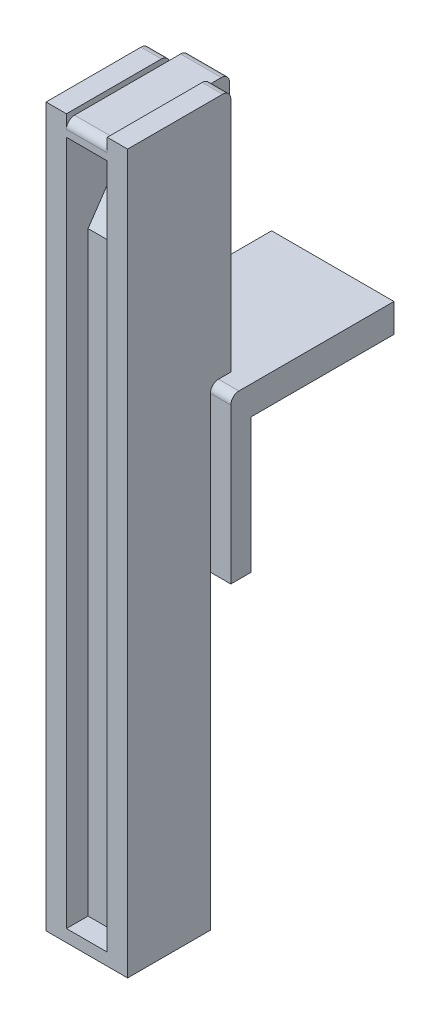
ISO-10303-21;
HEADER;
FILE_DESCRIPTION(('STEP AP214'),'2;1');
FILE_NAME('part.step','',(''),(''),'','','');
FILE_SCHEMA(('AUTOMOTIVE_DESIGN { 1 0 10303 214 1 1 1 1 }'));
ENDSEC;
DATA;
#1=APPLICATION_CONTEXT('core data for automotive mechanical design processes');
#2=APPLICATION_PROTOCOL_DEFINITION('international standard','automotive_design',2000,#1);
#3=PRODUCT_CONTEXT('',#1,'mechanical');
#4=PRODUCT('Part','Part','',(#3));
#5=PRODUCT_RELATED_PRODUCT_CATEGORY('part','',(#4));
#6=PRODUCT_DEFINITION_FORMATION('','',#4);
#7=PRODUCT_DEFINITION_CONTEXT('part definition',#1,'design');
#8=PRODUCT_DEFINITION('design','',#6,#7);
#9=PRODUCT_DEFINITION_SHAPE('','',#8);
#10=(LENGTH_UNIT() NAMED_UNIT(*) SI_UNIT(.MILLI.,.METRE.));
#11=(NAMED_UNIT(*) PLANE_ANGLE_UNIT() SI_UNIT($,.RADIAN.));
#12=(NAMED_UNIT(*) SI_UNIT($,.STERADIAN.) SOLID_ANGLE_UNIT());
#13=UNCERTAINTY_MEASURE_WITH_UNIT(LENGTH_MEASURE(1.E-05),#10,'distance_accuracy_value','');
#14=(GEOMETRIC_REPRESENTATION_CONTEXT(3) GLOBAL_UNCERTAINTY_ASSIGNED_CONTEXT((#13)) GLOBAL_UNIT_ASSIGNED_CONTEXT((#10,
#11,#12)) REPRESENTATION_CONTEXT('',''));
#15=CARTESIAN_POINT('',(0.,0.,0.));
#16=DIRECTION('',(0.,0.,1.));
#17=DIRECTION('',(1.,0.,0.));
#18=AXIS2_PLACEMENT_3D('',#15,#16,#17);
#19=CARTESIAN_POINT('',(-5.,0.,0.));
#20=DIRECTION('',(1.,0.,0.));
#21=DIRECTION('',(0.,0.,-1.));
#22=AXIS2_PLACEMENT_3D('',#19,#20,#21);
#23=PLANE('',#22);
#24=DIRECTION('',(0.,-1.,0.));
#25=VECTOR('',#24,1.);
#26=CARTESIAN_POINT('',(-5.,60.,20.3));
#27=LINE('',#26,#25);
#28=CARTESIAN_POINT('',(-5.,55.,20.3));
#29=VERTEX_POINT('',#28);
#30=CARTESIAN_POINT('',(-5.,-113.,20.3));
#31=VERTEX_POINT('',#30);
#32=EDGE_CURVE('E288',#29,#31,#27,.T.);
#33=ORIENTED_EDGE('',*,*,#32,.T.);
#34=DIRECTION('',(0.,0.,-1.));
#35=VECTOR('',#34,1.);
#36=CARTESIAN_POINT('',(-5.,-113.,20.3));
#37=LINE('',#36,#35);
#38=CARTESIAN_POINT('',(-5.,-113.,15.));
#39=VERTEX_POINT('',#38);
#40=EDGE_CURVE('E251',#31,#39,#37,.T.);
#41=ORIENTED_EDGE('',*,*,#40,.T.);
#42=DIRECTION('',(0.,-1.,0.));
#43=VECTOR('',#42,1.);
#44=CARTESIAN_POINT('',(-5.,-116.,15.));
#45=LINE('',#44,#43);
#46=CARTESIAN_POINT('',(-5.,32.9715744201414,15.));
#47=VERTEX_POINT('',#46);
#48=EDGE_CURVE('E327',#47,#39,#45,.T.);
#49=ORIENTED_EDGE('',*,*,#48,.F.);
#50=DIRECTION('',(0.,-0.826584392153763,0.56281279538386));
#51=VECTOR('',#50,1.);
#52=CARTESIAN_POINT('',(-5.,55.0015744201414,0.));
#53=LINE('',#52,#51);
#54=CARTESIAN_POINT('',(-5.,55.,0.00107200645125644));
#55=VERTEX_POINT('',#54);
#56=EDGE_CURVE('E320',#55,#47,#53,.T.);
#57=ORIENTED_EDGE('',*,*,#56,.F.);
#58=DIRECTION('',(0.,0.,1.));
#59=VECTOR('',#58,1.);
#60=CARTESIAN_POINT('',(-5.,55.,0.));
#61=LINE('',#60,#59);
#62=EDGE_CURVE('E521',#55,#29,#61,.T.);
#63=ORIENTED_EDGE('',*,*,#62,.T.);
#64=EDGE_LOOP('',(#33,#41,#49,#57,#63));
#65=FACE_BOUND('',#64,.T.);
#66=ADVANCED_FACE('F43',(#65),#23,.T.);
#67=CARTESIAN_POINT('',(5.,0.,0.));
#68=DIRECTION('',(-1.,0.,0.));
#69=DIRECTION('',(0.,0.,-1.));
#70=AXIS2_PLACEMENT_3D('',#67,#68,#69);
#71=PLANE('',#70);
#72=DIRECTION('',(0.,-1.,0.));
#73=VECTOR('',#72,1.);
#74=CARTESIAN_POINT('',(5.,-116.,15.));
#75=LINE('',#74,#73);
#76=CARTESIAN_POINT('',(5.,32.9715744201414,15.));
#77=VERTEX_POINT('',#76);
#78=CARTESIAN_POINT('',(5.,-113.,15.));
#79=VERTEX_POINT('',#78);
#80=EDGE_CURVE('E265',#77,#79,#75,.T.);
#81=ORIENTED_EDGE('',*,*,#80,.T.);
#82=DIRECTION('',(0.,0.,-1.));
#83=VECTOR('',#82,1.);
#84=CARTESIAN_POINT('',(5.,-113.,20.3));
#85=LINE('',#84,#83);
#86=CARTESIAN_POINT('',(5.,-113.,20.3));
#87=VERTEX_POINT('',#86);
#88=EDGE_CURVE('E248',#87,#79,#85,.T.);
#89=ORIENTED_EDGE('',*,*,#88,.F.);
#90=DIRECTION('',(0.,-1.,0.));
#91=VECTOR('',#90,1.);
#92=CARTESIAN_POINT('',(5.,60.,20.3));
#93=LINE('',#92,#91);
#94=CARTESIAN_POINT('',(5.,55.,20.3));
#95=VERTEX_POINT('',#94);
#96=EDGE_CURVE('E263',#95,#87,#93,.T.);
#97=ORIENTED_EDGE('',*,*,#96,.F.);
#98=DIRECTION('',(0.,0.,1.));
#99=VECTOR('',#98,1.);
#100=CARTESIAN_POINT('',(5.,55.,0.));
#101=LINE('',#100,#99);
#102=CARTESIAN_POINT('',(5.,55.,0.00107200645125644));
#103=VERTEX_POINT('',#102);
#104=EDGE_CURVE('E512',#103,#95,#101,.T.);
#105=ORIENTED_EDGE('',*,*,#104,.F.);
#106=DIRECTION('',(0.,-0.826584392153763,0.56281279538386));
#107=VECTOR('',#106,1.);
#108=CARTESIAN_POINT('',(5.,55.0015744201414,0.));
#109=LINE('',#108,#107);
#110=EDGE_CURVE('E325',#103,#77,#109,.T.);
#111=ORIENTED_EDGE('',*,*,#110,.T.);
#112=EDGE_LOOP('',(#81,#89,#97,#105,#111));
#113=FACE_BOUND('',#112,.T.);
#114=ADVANCED_FACE('F261',(#113),#71,.T.);
#115=CARTESIAN_POINT('',(5.,-116.,15.));
#116=DIRECTION('',(0.,0.,-1.));
#117=DIRECTION('',(-1.,0.,0.));
#118=AXIS2_PLACEMENT_3D('',#115,#116,#117);
#119=PLANE('',#118);
#120=DIRECTION('',(-1.,0.,0.));
#121=VECTOR('',#120,1.);
#122=CARTESIAN_POINT('',(-5.,-113.,15.));
#123=LINE('',#122,#121);
#124=EDGE_CURVE('E256',#79,#39,#123,.T.);
#125=ORIENTED_EDGE('',*,*,#124,.F.);
#126=ORIENTED_EDGE('',*,*,#80,.F.);
#127=DIRECTION('',(-1.,0.,0.));
#128=VECTOR('',#127,1.);
#129=CARTESIAN_POINT('',(5.,32.9715744201414,15.));
#130=LINE('',#129,#128);
#131=EDGE_CURVE('E334',#77,#47,#130,.T.);
#132=ORIENTED_EDGE('',*,*,#131,.T.);
#133=ORIENTED_EDGE('',*,*,#48,.T.);
#134=EDGE_LOOP('',(#125,#126,#132,#133));
#135=FACE_BOUND('',#134,.T.);
#136=ADVANCED_FACE('F530',(#135),#119,.F.);
#137=CARTESIAN_POINT('',(5.,55.0015744201414,0.));
#138=DIRECTION('',(0.,-0.56281279538386,-0.826584392153763));
#139=DIRECTION('',(0.,0.826584392153763,-0.56281279538386));
#140=AXIS2_PLACEMENT_3D('',#137,#138,#139);
#141=PLANE('',#140);
#142=DIRECTION('',(1.,0.,0.));
#143=VECTOR('',#142,1.);
#144=CARTESIAN_POINT('',(5.,55.,0.00107200645125644));
#145=LINE('',#144,#143);
#146=EDGE_CURVE('E272',#55,#103,#145,.T.);
#147=ORIENTED_EDGE('',*,*,#146,.F.);
#148=ORIENTED_EDGE('',*,*,#56,.T.);
#149=ORIENTED_EDGE('',*,*,#131,.F.);
#150=ORIENTED_EDGE('',*,*,#110,.F.);
#151=EDGE_LOOP('',(#147,#148,#149,#150));
#152=FACE_BOUND('',#151,.T.);
#153=ADVANCED_FACE('F535',(#152),#141,.F.);
#154=DIRECTION('',(0.,0.,-1.));
#155=VECTOR('',#154,1.);
#156=CARTESIAN_POINT('',(-5.,58.7,20.3));
#157=LINE('',#156,#155);
#158=CARTESIAN_POINT('',(-5.,58.7,18.3));
#159=VERTEX_POINT('',#158);
#160=CARTESIAN_POINT('',(-5.,58.7,-4.87349939951952));
#161=VERTEX_POINT('',#160);
#162=EDGE_CURVE('E517',#159,#161,#157,.T.);
#163=ORIENTED_EDGE('',*,*,#162,.T.);
#164=CARTESIAN_POINT('',(-5.,58.,-3.));
#165=DIRECTION('',(1.,0.,0.));
#166=DIRECTION('',(0.,0.,-1.));
#167=AXIS2_PLACEMENT_3D('',#164,#165,#166);
#168=CIRCLE('',#167,2.);
#169=CARTESIAN_POINT('',(-5.,60.,-3.));
#170=VERTEX_POINT('',#169);
#171=EDGE_CURVE('E407',#161,#170,#168,.T.);
#172=ORIENTED_EDGE('',*,*,#171,.T.);
#173=DIRECTION('',(0.,0.,1.));
#174=VECTOR('',#173,1.);
#175=CARTESIAN_POINT('',(-5.,60.,0.));
#176=LINE('',#175,#174);
#177=CARTESIAN_POINT('',(-5.,60.,20.3));
#178=VERTEX_POINT('',#177);
#179=EDGE_CURVE('E296',#170,#178,#176,.T.);
#180=ORIENTED_EDGE('',*,*,#179,.T.);
#181=CARTESIAN_POINT('',(-5.,56.7,20.3));
#182=VERTEX_POINT('',#181);
#183=EDGE_CURVE('E311',#178,#182,#27,.T.);
#184=ORIENTED_EDGE('',*,*,#183,.T.);
#185=CARTESIAN_POINT('',(-5.,56.7,18.3));
#186=DIRECTION('',(1.,0.,0.));
#187=DIRECTION('',(0.,0.,-1.));
#188=AXIS2_PLACEMENT_3D('',#185,#186,#187);
#189=CIRCLE('',#188,2.);
#190=EDGE_CURVE('E416',#182,#159,#189,.F.);
#191=ORIENTED_EDGE('',*,*,#190,.T.);
#192=EDGE_LOOP('',(#163,#172,#180,#184,#191));
#193=FACE_BOUND('',#192,.T.);
#194=ADVANCED_FACE('F556',(#193),#23,.T.);
#195=DIRECTION('',(0.,0.,1.));
#196=VECTOR('',#195,1.);
#197=CARTESIAN_POINT('',(5.,60.,-5.));
#198=LINE('',#197,#196);
#199=CARTESIAN_POINT('',(5.,60.,-3.));
#200=VERTEX_POINT('',#199);
#201=CARTESIAN_POINT('',(5.,60.,20.3));
#202=VERTEX_POINT('',#201);
#203=EDGE_CURVE('E274',#200,#202,#198,.T.);
#204=ORIENTED_EDGE('',*,*,#203,.F.);
#205=CARTESIAN_POINT('',(5.,58.,-3.));
#206=DIRECTION('',(-1.,0.,0.));
#207=DIRECTION('',(0.,0.,1.));
#208=AXIS2_PLACEMENT_3D('',#205,#206,#207);
#209=CIRCLE('',#208,2.);
#210=CARTESIAN_POINT('',(5.,58.7,-4.87349939951952));
#211=VERTEX_POINT('',#210);
#212=EDGE_CURVE('E397',#200,#211,#209,.T.);
#213=ORIENTED_EDGE('',*,*,#212,.T.);
#214=DIRECTION('',(0.,0.,-1.));
#215=VECTOR('',#214,1.);
#216=CARTESIAN_POINT('',(5.,58.7,20.3));
#217=LINE('',#216,#215);
#218=CARTESIAN_POINT('',(5.,58.7,18.3));
#219=VERTEX_POINT('',#218);
#220=EDGE_CURVE('E508',#219,#211,#217,.T.);
#221=ORIENTED_EDGE('',*,*,#220,.F.);
#222=CARTESIAN_POINT('',(5.,56.7,18.3));
#223=DIRECTION('',(-1.,0.,0.));
#224=DIRECTION('',(0.,0.,1.));
#225=AXIS2_PLACEMENT_3D('',#222,#223,#224);
#226=CIRCLE('',#225,2.);
#227=CARTESIAN_POINT('',(5.,56.7,20.3));
#228=VERTEX_POINT('',#227);
#229=EDGE_CURVE('E413',#219,#228,#226,.F.);
#230=ORIENTED_EDGE('',*,*,#229,.T.);
#231=EDGE_CURVE('E271',#202,#228,#93,.T.);
#232=ORIENTED_EDGE('',*,*,#231,.F.);
#233=EDGE_LOOP('',(#204,#213,#221,#230,#232));
#234=FACE_BOUND('',#233,.T.);
#235=ADVANCED_FACE('F562',(#234),#71,.T.);
#236=CARTESIAN_POINT('',(15.,0.,-40.));
#237=DIRECTION('',(0.,-1.,0.));
#238=DIRECTION('',(0.,0.,-1.));
#239=AXIS2_PLACEMENT_3D('',#236,#237,#238);
#240=PLANE('',#239);
#241=DIRECTION('',(0.,0.,1.));
#242=VECTOR('',#241,1.);
#243=CARTESIAN_POINT('',(-15.,0.,-40.));
#244=LINE('',#243,#242);
#245=CARTESIAN_POINT('',(-15.,0.,-40.));
#246=VERTEX_POINT('',#245);
#247=CARTESIAN_POINT('',(-15.,0.,-2.));
#248=VERTEX_POINT('',#247);
#249=EDGE_CURVE('E337',#246,#248,#244,.T.);
#250=ORIENTED_EDGE('',*,*,#249,.T.);
#251=DIRECTION('',(-1.,0.,0.));
#252=VECTOR('',#251,1.);
#253=CARTESIAN_POINT('',(15.,0.,-2.));
#254=LINE('',#253,#252);
#255=CARTESIAN_POINT('',(-10.,0.,-2.));
#256=VERTEX_POINT('',#255);
#257=EDGE_CURVE('E430',#248,#256,#254,.F.);
#258=ORIENTED_EDGE('',*,*,#257,.T.);
#259=DIRECTION('',(0.,0.,-1.));
#260=VECTOR('',#259,1.);
#261=CARTESIAN_POINT('',(-10.,0.,0.));
#262=LINE('',#261,#260);
#263=CARTESIAN_POINT('',(-10.,0.,-5.));
#264=VERTEX_POINT('',#263);
#265=EDGE_CURVE('E303',#256,#264,#262,.T.);
#266=ORIENTED_EDGE('',*,*,#265,.T.);
#267=DIRECTION('',(1.,0.,0.));
#268=VECTOR('',#267,1.);
#269=CARTESIAN_POINT('',(-10.,0.,-5.));
#270=LINE('',#269,#268);
#271=CARTESIAN_POINT('',(-5.,0.,-5.));
#272=VERTEX_POINT('',#271);
#273=EDGE_CURVE('E321',#264,#272,#270,.T.);
#274=ORIENTED_EDGE('',*,*,#273,.T.);
#275=DIRECTION('',(0.,0.,1.));
#276=VECTOR('',#275,1.);
#277=CARTESIAN_POINT('',(-5.,0.,-9.69999999999999));
#278=LINE('',#277,#276);
#279=CARTESIAN_POINT('',(-5.,0.,-9.69999999999999));
#280=VERTEX_POINT('',#279);
#281=EDGE_CURVE('E507',#280,#272,#278,.T.);
#282=ORIENTED_EDGE('',*,*,#281,.F.);
#283=DIRECTION('',(1.,0.,0.));
#284=VECTOR('',#283,1.);
#285=CARTESIAN_POINT('',(-5.,0.,-9.69999999999999));
#286=LINE('',#285,#284);
#287=CARTESIAN_POINT('',(5.,0.,-9.69999999999999));
#288=VERTEX_POINT('',#287);
#289=EDGE_CURVE('E501',#280,#288,#286,.T.);
#290=ORIENTED_EDGE('',*,*,#289,.T.);
#291=DIRECTION('',(0.,0.,1.));
#292=VECTOR('',#291,1.);
#293=CARTESIAN_POINT('',(5.,0.,-9.69999999999999));
#294=LINE('',#293,#292);
#295=CARTESIAN_POINT('',(5.,0.,-5.));
#296=VERTEX_POINT('',#295);
#297=EDGE_CURVE('E266',#288,#296,#294,.T.);
#298=ORIENTED_EDGE('',*,*,#297,.T.);
#299=DIRECTION('',(-1.,0.,0.));
#300=VECTOR('',#299,1.);
#301=CARTESIAN_POINT('',(10.,0.,-5.));
#302=LINE('',#301,#300);
#303=CARTESIAN_POINT('',(10.,0.,-5.));
#304=VERTEX_POINT('',#303);
#305=EDGE_CURVE('E285',#304,#296,#302,.T.);
#306=ORIENTED_EDGE('',*,*,#305,.F.);
#307=DIRECTION('',(0.,0.,-1.));
#308=VECTOR('',#307,1.);
#309=CARTESIAN_POINT('',(10.,0.,0.));
#310=LINE('',#309,#308);
#311=CARTESIAN_POINT('',(10.,0.,-2.));
#312=VERTEX_POINT('',#311);
#313=EDGE_CURVE('E490',#312,#304,#310,.T.);
#314=ORIENTED_EDGE('',*,*,#313,.F.);
#315=DIRECTION('',(-1.,0.,0.));
#316=VECTOR('',#315,1.);
#317=CARTESIAN_POINT('',(15.,0.,-2.));
#318=LINE('',#317,#316);
#319=CARTESIAN_POINT('',(15.,0.,-2.));
#320=VERTEX_POINT('',#319);
#321=EDGE_CURVE('E428',#312,#320,#318,.F.);
#322=ORIENTED_EDGE('',*,*,#321,.T.);
#323=DIRECTION('',(0.,0.,1.));
#324=VECTOR('',#323,1.);
#325=CARTESIAN_POINT('',(15.,0.,-40.));
#326=LINE('',#325,#324);
#327=CARTESIAN_POINT('',(15.,0.,-40.));
#328=VERTEX_POINT('',#327);
#329=EDGE_CURVE('E338',#328,#320,#326,.T.);
#330=ORIENTED_EDGE('',*,*,#329,.F.);
#331=DIRECTION('',(-1.,0.,0.));
#332=VECTOR('',#331,1.);
#333=CARTESIAN_POINT('',(15.,0.,-40.));
#334=LINE('',#333,#332);
#335=EDGE_CURVE('E351',#328,#246,#334,.T.);
#336=ORIENTED_EDGE('',*,*,#335,.T.);
#337=EDGE_LOOP('',(#250,#258,#266,#274,#282,#290,#298,#306,#314,#322,#330,#336));
#338=FACE_BOUND('',#337,.T.);
#339=ADVANCED_FACE('F458',(#338),#240,.F.);
#340=CARTESIAN_POINT('',(15.,0.,0.));
#341=DIRECTION('',(0.,0.,-1.));
#342=DIRECTION('',(-1.,0.,0.));
#343=AXIS2_PLACEMENT_3D('',#340,#341,#342);
#344=PLANE('',#343);
#345=DIRECTION('',(0.,-1.,0.));
#346=VECTOR('',#345,1.);
#347=CARTESIAN_POINT('',(15.,0.,0.));
#348=LINE('',#347,#346);
#349=CARTESIAN_POINT('',(15.,-2.,0.));
#350=VERTEX_POINT('',#349);
#351=CARTESIAN_POINT('',(15.,-40.,0.));
#352=VERTEX_POINT('',#351);
#353=EDGE_CURVE('E340',#350,#352,#348,.T.);
#354=ORIENTED_EDGE('',*,*,#353,.F.);
#355=DIRECTION('',(-1.,0.,0.));
#356=VECTOR('',#355,1.);
#357=CARTESIAN_POINT('',(15.,-2.,0.));
#358=LINE('',#357,#356);
#359=CARTESIAN_POINT('',(10.,-2.00000000000003,0.));
#360=VERTEX_POINT('',#359);
#361=EDGE_CURVE('E432',#350,#360,#358,.T.);
#362=ORIENTED_EDGE('',*,*,#361,.T.);
#363=DIRECTION('',(0.,1.,0.));
#364=VECTOR('',#363,1.);
#365=CARTESIAN_POINT('',(10.,-116.,0.));
#366=LINE('',#365,#364);
#367=CARTESIAN_POINT('',(10.,-40.,0.));
#368=VERTEX_POINT('',#367);
#369=EDGE_CURVE('E487',#368,#360,#366,.T.);
#370=ORIENTED_EDGE('',*,*,#369,.F.);
#371=DIRECTION('',(-1.,0.,0.));
#372=VECTOR('',#371,1.);
#373=CARTESIAN_POINT('',(15.,-40.,0.));
#374=LINE('',#373,#372);
#375=EDGE_CURVE('E375',#352,#368,#374,.T.);
#376=ORIENTED_EDGE('',*,*,#375,.F.);
#377=EDGE_LOOP('',(#354,#362,#370,#376));
#378=FACE_BOUND('',#377,.T.);
#379=ADVANCED_FACE('F488',(#378),#344,.F.);
#380=DIRECTION('',(0.,1.,0.));
#381=VECTOR('',#380,1.);
#382=CARTESIAN_POINT('',(-10.,-116.,0.));
#383=LINE('',#382,#381);
#384=CARTESIAN_POINT('',(-10.,-40.,0.));
#385=VERTEX_POINT('',#384);
#386=CARTESIAN_POINT('',(-10.,-2.00000000000003,0.));
#387=VERTEX_POINT('',#386);
#388=EDGE_CURVE('E299',#385,#387,#383,.T.);
#389=ORIENTED_EDGE('',*,*,#388,.T.);
#390=DIRECTION('',(-1.,0.,0.));
#391=VECTOR('',#390,1.);
#392=CARTESIAN_POINT('',(15.,-2.,0.));
#393=LINE('',#392,#391);
#394=CARTESIAN_POINT('',(-15.,-2.,0.));
#395=VERTEX_POINT('',#394);
#396=EDGE_CURVE('E423',#387,#395,#393,.T.);
#397=ORIENTED_EDGE('',*,*,#396,.T.);
#398=DIRECTION('',(0.,-1.,0.));
#399=VECTOR('',#398,1.);
#400=CARTESIAN_POINT('',(-15.,0.,0.));
#401=LINE('',#400,#399);
#402=CARTESIAN_POINT('',(-15.,-40.,0.));
#403=VERTEX_POINT('',#402);
#404=EDGE_CURVE('E354',#395,#403,#401,.T.);
#405=ORIENTED_EDGE('',*,*,#404,.T.);
#406=EDGE_CURVE('E374',#385,#403,#374,.T.);
#407=ORIENTED_EDGE('',*,*,#406,.F.);
#408=EDGE_LOOP('',(#389,#397,#405,#407));
#409=FACE_BOUND('',#408,.T.);
#410=ADVANCED_FACE('F448',(#409),#344,.F.);
#411=CARTESIAN_POINT('',(15.,-40.,0.));
#412=DIRECTION('',(0.,1.,0.));
#413=DIRECTION('',(0.,0.,1.));
#414=AXIS2_PLACEMENT_3D('',#411,#412,#413);
#415=PLANE('',#414);
#416=DIRECTION('',(0.,0.,-1.));
#417=VECTOR('',#416,1.);
#418=CARTESIAN_POINT('',(-15.,-40.,0.));
#419=LINE('',#418,#417);
#420=CARTESIAN_POINT('',(-15.,-40.,-5.00000000000001));
#421=VERTEX_POINT('',#420);
#422=EDGE_CURVE('E356',#403,#421,#419,.T.);
#423=ORIENTED_EDGE('',*,*,#422,.T.);
#424=DIRECTION('',(-1.,0.,0.));
#425=VECTOR('',#424,1.);
#426=CARTESIAN_POINT('',(15.,-40.,-5.00000000000001));
#427=LINE('',#426,#425);
#428=CARTESIAN_POINT('',(15.,-40.,-5.00000000000001));
#429=VERTEX_POINT('',#428);
#430=EDGE_CURVE('E371',#429,#421,#427,.T.);
#431=ORIENTED_EDGE('',*,*,#430,.F.);
#432=DIRECTION('',(0.,0.,-1.));
#433=VECTOR('',#432,1.);
#434=CARTESIAN_POINT('',(15.,-40.,0.));
#435=LINE('',#434,#433);
#436=EDGE_CURVE('E343',#352,#429,#435,.T.);
#437=ORIENTED_EDGE('',*,*,#436,.F.);
#438=ORIENTED_EDGE('',*,*,#375,.T.);
#439=EDGE_CURVE('E379',#368,#385,#374,.T.);
#440=ORIENTED_EDGE('',*,*,#439,.T.);
#441=ORIENTED_EDGE('',*,*,#406,.T.);
#442=EDGE_LOOP('',(#423,#431,#437,#438,#440,#441));
#443=FACE_BOUND('',#442,.T.);
#444=ADVANCED_FACE('F477',(#443),#415,.F.);
#445=CARTESIAN_POINT('',(15.,-40.,-5.00000000000001));
#446=DIRECTION('',(0.,0.,1.));
#447=DIRECTION('',(1.,0.,0.));
#448=AXIS2_PLACEMENT_3D('',#445,#446,#447);
#449=PLANE('',#448);
#450=DIRECTION('',(0.,1.,0.));
#451=VECTOR('',#450,1.);
#452=CARTESIAN_POINT('',(-15.,-40.,-5.00000000000001));
#453=LINE('',#452,#451);
#454=CARTESIAN_POINT('',(-15.,-7.00000000000001,-5.00000000000001));
#455=VERTEX_POINT('',#454);
#456=EDGE_CURVE('E358',#421,#455,#453,.T.);
#457=ORIENTED_EDGE('',*,*,#456,.T.);
#458=DIRECTION('',(-1.,0.,0.));
#459=VECTOR('',#458,1.);
#460=CARTESIAN_POINT('',(15.,-7.00000000000001,-5.00000000000001));
#461=LINE('',#460,#459);
#462=CARTESIAN_POINT('',(15.,-7.00000000000001,-5.00000000000001));
#463=VERTEX_POINT('',#462);
#464=EDGE_CURVE('E368',#463,#455,#461,.T.);
#465=ORIENTED_EDGE('',*,*,#464,.F.);
#466=DIRECTION('',(0.,1.,0.));
#467=VECTOR('',#466,1.);
#468=CARTESIAN_POINT('',(15.,-40.,-5.00000000000001));
#469=LINE('',#468,#467);
#470=EDGE_CURVE('E345',#429,#463,#469,.T.);
#471=ORIENTED_EDGE('',*,*,#470,.F.);
#472=ORIENTED_EDGE('',*,*,#430,.T.);
#473=EDGE_LOOP('',(#457,#465,#471,#472));
#474=FACE_BOUND('',#473,.T.);
#475=ADVANCED_FACE('F473',(#474),#449,.F.);
#476=CARTESIAN_POINT('',(15.,-7.00000000000001,-5.00000000000001));
#477=DIRECTION('',(0.,1.,0.));
#478=DIRECTION('',(0.,0.,1.));
#479=AXIS2_PLACEMENT_3D('',#476,#477,#478);
#480=PLANE('',#479);
#481=DIRECTION('',(0.,0.,-1.));
#482=VECTOR('',#481,1.);
#483=CARTESIAN_POINT('',(-15.,-7.00000000000001,-5.00000000000001));
#484=LINE('',#483,#482);
#485=CARTESIAN_POINT('',(-15.,-7.00000000000001,-40.));
#486=VERTEX_POINT('',#485);
#487=EDGE_CURVE('E360',#455,#486,#484,.T.);
#488=ORIENTED_EDGE('',*,*,#487,.T.);
#489=DIRECTION('',(-1.,0.,0.));
#490=VECTOR('',#489,1.);
#491=CARTESIAN_POINT('',(15.,-7.00000000000001,-40.));
#492=LINE('',#491,#490);
#493=CARTESIAN_POINT('',(15.,-7.00000000000001,-40.));
#494=VERTEX_POINT('',#493);
#495=EDGE_CURVE('E365',#494,#486,#492,.T.);
#496=ORIENTED_EDGE('',*,*,#495,.F.);
#497=DIRECTION('',(0.,0.,-1.));
#498=VECTOR('',#497,1.);
#499=CARTESIAN_POINT('',(15.,-7.00000000000001,-5.00000000000001));
#500=LINE('',#499,#498);
#501=EDGE_CURVE('E347',#463,#494,#500,.T.);
#502=ORIENTED_EDGE('',*,*,#501,.F.);
#503=ORIENTED_EDGE('',*,*,#464,.T.);
#504=EDGE_LOOP('',(#488,#496,#502,#503));
#505=FACE_BOUND('',#504,.T.);
#506=ADVANCED_FACE('F468',(#505),#480,.F.);
#507=CARTESIAN_POINT('',(15.,-7.00000000000001,-40.));
#508=DIRECTION('',(0.,0.,1.));
#509=DIRECTION('',(1.,0.,0.));
#510=AXIS2_PLACEMENT_3D('',#507,#508,#509);
#511=PLANE('',#510);
#512=DIRECTION('',(0.,1.,0.));
#513=VECTOR('',#512,1.);
#514=CARTESIAN_POINT('',(-15.,-7.00000000000001,-40.));
#515=LINE('',#514,#513);
#516=EDGE_CURVE('E341',#486,#246,#515,.T.);
#517=ORIENTED_EDGE('',*,*,#516,.T.);
#518=ORIENTED_EDGE('',*,*,#335,.F.);
#519=DIRECTION('',(0.,1.,0.));
#520=VECTOR('',#519,1.);
#521=CARTESIAN_POINT('',(15.,-7.00000000000001,-40.));
#522=LINE('',#521,#520);
#523=EDGE_CURVE('E349',#494,#328,#522,.T.);
#524=ORIENTED_EDGE('',*,*,#523,.F.);
#525=ORIENTED_EDGE('',*,*,#495,.T.);
#526=EDGE_LOOP('',(#517,#518,#524,#525));
#527=FACE_BOUND('',#526,.T.);
#528=ADVANCED_FACE('F463',(#527),#511,.F.);
#529=CARTESIAN_POINT('',(15.,0.,0.));
#530=DIRECTION('',(1.,0.,0.));
#531=DIRECTION('',(0.,0.,-1.));
#532=AXIS2_PLACEMENT_3D('',#529,#530,#531);
#533=PLANE('',#532);
#534=ORIENTED_EDGE('',*,*,#329,.T.);
#535=CARTESIAN_POINT('',(15.,-2.,-2.));
#536=DIRECTION('',(1.,0.,0.));
#537=DIRECTION('',(0.,0.,-1.));
#538=AXIS2_PLACEMENT_3D('',#535,#536,#537);
#539=CIRCLE('',#538,2.);
#540=EDGE_CURVE('E58',#320,#350,#539,.T.);
#541=ORIENTED_EDGE('',*,*,#540,.T.);
#542=ORIENTED_EDGE('',*,*,#353,.T.);
#543=ORIENTED_EDGE('',*,*,#436,.T.);
#544=ORIENTED_EDGE('',*,*,#470,.T.);
#545=ORIENTED_EDGE('',*,*,#501,.T.);
#546=ORIENTED_EDGE('',*,*,#523,.T.);
#547=EDGE_LOOP('',(#534,#541,#542,#543,#544,#545,#546));
#548=FACE_BOUND('',#547,.T.);
#549=ADVANCED_FACE('F649',(#548),#533,.T.);
#550=CARTESIAN_POINT('',(-15.,0.,0.));
#551=DIRECTION('',(1.,0.,0.));
#552=DIRECTION('',(0.,0.,-1.));
#553=AXIS2_PLACEMENT_3D('',#550,#551,#552);
#554=PLANE('',#553);
#555=ORIENTED_EDGE('',*,*,#404,.F.);
#556=CARTESIAN_POINT('',(-15.,-2.,-2.));
#557=DIRECTION('',(1.,0.,0.));
#558=DIRECTION('',(0.,0.,-1.));
#559=AXIS2_PLACEMENT_3D('',#556,#557,#558);
#560=CIRCLE('',#559,2.);
#561=EDGE_CURVE('E426',#395,#248,#560,.F.);
#562=ORIENTED_EDGE('',*,*,#561,.T.);
#563=ORIENTED_EDGE('',*,*,#249,.F.);
#564=ORIENTED_EDGE('',*,*,#516,.F.);
#565=ORIENTED_EDGE('',*,*,#487,.F.);
#566=ORIENTED_EDGE('',*,*,#456,.F.);
#567=ORIENTED_EDGE('',*,*,#422,.F.);
#568=EDGE_LOOP('',(#555,#562,#563,#564,#565,#566,#567));
#569=FACE_BOUND('',#568,.T.);
#570=ADVANCED_FACE('F454',(#569),#554,.F.);
#571=CARTESIAN_POINT('',(5.,-116.,0.));
#572=DIRECTION('',(0.,0.,1.));
#573=DIRECTION('',(1.,0.,0.));
#574=AXIS2_PLACEMENT_3D('',#571,#572,#573);
#575=PLANE('',#574);
#576=ORIENTED_EDGE('',*,*,#439,.F.);
#577=CARTESIAN_POINT('',(10.,-116.,0.));
#578=VERTEX_POINT('',#577);
#579=EDGE_CURVE('E484',#578,#368,#366,.T.);
#580=ORIENTED_EDGE('',*,*,#579,.F.);
#581=DIRECTION('',(-1.,0.,0.));
#582=VECTOR('',#581,1.);
#583=CARTESIAN_POINT('',(5.,-116.,0.));
#584=LINE('',#583,#582);
#585=CARTESIAN_POINT('',(-10.,-116.,0.));
#586=VERTEX_POINT('',#585);
#587=EDGE_CURVE('E329',#578,#586,#584,.T.);
#588=ORIENTED_EDGE('',*,*,#587,.T.);
#589=EDGE_CURVE('E300',#586,#385,#383,.T.);
#590=ORIENTED_EDGE('',*,*,#589,.T.);
#591=EDGE_LOOP('',(#576,#580,#588,#590));
#592=FACE_BOUND('',#591,.T.);
#593=ADVANCED_FACE('F483',(#592),#575,.F.);
#594=CARTESIAN_POINT('',(5.,-116.,0.));
#595=DIRECTION('',(0.,1.,0.));
#596=DIRECTION('',(0.,0.,1.));
#597=AXIS2_PLACEMENT_3D('',#594,#595,#596);
#598=PLANE('',#597);
#599=DIRECTION('',(0.,0.,-1.));
#600=VECTOR('',#599,1.);
#601=CARTESIAN_POINT('',(10.,-116.,20.3));
#602=LINE('',#601,#600);
#603=CARTESIAN_POINT('',(10.,-116.,20.3));
#604=VERTEX_POINT('',#603);
#605=EDGE_CURVE('E278',#604,#578,#602,.T.);
#606=ORIENTED_EDGE('',*,*,#605,.F.);
#607=DIRECTION('',(1.,0.,0.));
#608=VECTOR('',#607,1.);
#609=CARTESIAN_POINT('',(-10.,-116.,20.3));
#610=LINE('',#609,#608);
#611=CARTESIAN_POINT('',(-10.,-116.,20.3));
#612=VERTEX_POINT('',#611);
#613=EDGE_CURVE('E310',#612,#604,#610,.T.);
#614=ORIENTED_EDGE('',*,*,#613,.F.);
#615=DIRECTION('',(0.,0.,-1.));
#616=VECTOR('',#615,1.);
#617=CARTESIAN_POINT('',(-10.,-116.,20.3));
#618=LINE('',#617,#616);
#619=EDGE_CURVE('E295',#612,#586,#618,.T.);
#620=ORIENTED_EDGE('',*,*,#619,.T.);
#621=ORIENTED_EDGE('',*,*,#587,.F.);
#622=EDGE_LOOP('',(#606,#614,#620,#621));
#623=FACE_BOUND('',#622,.T.);
#624=ADVANCED_FACE('F642',(#623),#598,.F.);
#625=CARTESIAN_POINT('',(-10.,60.,20.3));
#626=DIRECTION('',(0.,0.,1.));
#627=DIRECTION('',(0.,-1.,0.));
#628=AXIS2_PLACEMENT_3D('',#625,#626,#627);
#629=PLANE('',#628);
#630=ORIENTED_EDGE('',*,*,#231,.T.);
#631=DIRECTION('',(1.,0.,0.));
#632=VECTOR('',#631,1.);
#633=CARTESIAN_POINT('',(-5.,56.7,20.3));
#634=LINE('',#633,#632);
#635=EDGE_CURVE('E384',#228,#182,#634,.F.);
#636=ORIENTED_EDGE('',*,*,#635,.T.);
#637=ORIENTED_EDGE('',*,*,#183,.F.);
#638=DIRECTION('',(1.,0.,0.));
#639=VECTOR('',#638,1.);
#640=CARTESIAN_POINT('',(-10.,60.,20.3));
#641=LINE('',#640,#639);
#642=CARTESIAN_POINT('',(-10.,60.,20.3));
#643=VERTEX_POINT('',#642);
#644=EDGE_CURVE('E317',#643,#178,#641,.T.);
#645=ORIENTED_EDGE('',*,*,#644,.F.);
#646=DIRECTION('',(0.,-1.,0.));
#647=VECTOR('',#646,1.);
#648=CARTESIAN_POINT('',(-10.,60.,20.3));
#649=LINE('',#648,#647);
#650=EDGE_CURVE('E292',#643,#612,#649,.T.);
#651=ORIENTED_EDGE('',*,*,#650,.T.);
#652=ORIENTED_EDGE('',*,*,#613,.T.);
#653=DIRECTION('',(0.,-1.,0.));
#654=VECTOR('',#653,1.);
#655=CARTESIAN_POINT('',(10.,60.,20.3));
#656=LINE('',#655,#654);
#657=CARTESIAN_POINT('',(10.,60.,20.3));
#658=VERTEX_POINT('',#657);
#659=EDGE_CURVE('E284',#658,#604,#656,.T.);
#660=ORIENTED_EDGE('',*,*,#659,.F.);
#661=DIRECTION('',(-1.,0.,0.));
#662=VECTOR('',#661,1.);
#663=CARTESIAN_POINT('',(10.,60.,20.3));
#664=LINE('',#663,#662);
#665=EDGE_CURVE('E289',#658,#202,#664,.T.);
#666=ORIENTED_EDGE('',*,*,#665,.T.);
#667=EDGE_LOOP('',(#630,#636,#637,#645,#651,#652,#660,#666));
#668=FACE_BOUND('',#667,.T.);
#669=DIRECTION('',(-1.,0.,0.));
#670=VECTOR('',#669,1.);
#671=CARTESIAN_POINT('',(-5.,-113.,20.3));
#672=LINE('',#671,#670);
#673=EDGE_CURVE('E245',#87,#31,#672,.T.);
#674=ORIENTED_EDGE('',*,*,#673,.T.);
#675=ORIENTED_EDGE('',*,*,#32,.F.);
#676=DIRECTION('',(1.,0.,0.));
#677=VECTOR('',#676,1.);
#678=CARTESIAN_POINT('',(-5.,55.,20.3));
#679=LINE('',#678,#677);
#680=EDGE_CURVE('E270',#29,#95,#679,.T.);
#681=ORIENTED_EDGE('',*,*,#680,.T.);
#682=ORIENTED_EDGE('',*,*,#96,.T.);
#683=EDGE_LOOP('',(#674,#675,#681,#682));
#684=FACE_BOUND('',#683,.T.);
#685=ADVANCED_FACE('F269',(#668,#684),#629,.T.);
#686=CARTESIAN_POINT('',(-10.,60.,0.));
#687=DIRECTION('',(0.,1.,0.));
#688=DIRECTION('',(0.,0.,1.));
#689=AXIS2_PLACEMENT_3D('',#686,#687,#688);
#690=PLANE('',#689);
#691=ORIENTED_EDGE('',*,*,#179,.F.);
#692=DIRECTION('',(1.,0.,0.));
#693=VECTOR('',#692,1.);
#694=CARTESIAN_POINT('',(-10.,60.,-3.));
#695=LINE('',#694,#693);
#696=CARTESIAN_POINT('',(-10.,60.,-3.));
#697=VERTEX_POINT('',#696);
#698=EDGE_CURVE('E409',#170,#697,#695,.F.);
#699=ORIENTED_EDGE('',*,*,#698,.T.);
#700=DIRECTION('',(0.,0.,1.));
#701=VECTOR('',#700,1.);
#702=CARTESIAN_POINT('',(-10.,60.,-5.));
#703=LINE('',#702,#701);
#704=EDGE_CURVE('E308',#697,#643,#703,.T.);
#705=ORIENTED_EDGE('',*,*,#704,.T.);
#706=ORIENTED_EDGE('',*,*,#644,.T.);
#707=EDGE_LOOP('',(#691,#699,#705,#706));
#708=FACE_BOUND('',#707,.T.);
#709=ADVANCED_FACE('F585',(#708),#690,.T.);
#710=CARTESIAN_POINT('',(-10.,0.,-5.));
#711=DIRECTION('',(0.,0.,-1.));
#712=DIRECTION('',(-1.,0.,0.));
#713=AXIS2_PLACEMENT_3D('',#710,#711,#712);
#714=PLANE('',#713);
#715=DIRECTION('',(0.,1.,0.));
#716=VECTOR('',#715,1.);
#717=CARTESIAN_POINT('',(-10.,0.,-5.));
#718=LINE('',#717,#716);
#719=CARTESIAN_POINT('',(-10.,58.,-5.));
#720=VERTEX_POINT('',#719);
#721=EDGE_CURVE('E305',#264,#720,#718,.T.);
#722=ORIENTED_EDGE('',*,*,#721,.T.);
#723=DIRECTION('',(1.,0.,0.));
#724=VECTOR('',#723,1.);
#725=CARTESIAN_POINT('',(-10.,58.,-5.));
#726=LINE('',#725,#724);
#727=CARTESIAN_POINT('',(-5.,58.,-5.));
#728=VERTEX_POINT('',#727);
#729=EDGE_CURVE('E404',#720,#728,#726,.T.);
#730=ORIENTED_EDGE('',*,*,#729,.T.);
#731=DIRECTION('',(0.,1.,0.));
#732=VECTOR('',#731,1.);
#733=CARTESIAN_POINT('',(-5.,0.,-5.));
#734=LINE('',#733,#732);
#735=EDGE_CURVE('E313',#272,#728,#734,.T.);
#736=ORIENTED_EDGE('',*,*,#735,.F.);
#737=ORIENTED_EDGE('',*,*,#273,.F.);
#738=EDGE_LOOP('',(#722,#730,#736,#737));
#739=FACE_BOUND('',#738,.T.);
#740=ADVANCED_FACE('F633',(#739),#714,.T.);
#741=CARTESIAN_POINT('',(-10.,0.,0.));
#742=DIRECTION('',(1.,0.,0.));
#743=DIRECTION('',(0.,0.,-1.));
#744=AXIS2_PLACEMENT_3D('',#741,#742,#743);
#745=PLANE('',#744);
#746=ORIENTED_EDGE('',*,*,#704,.F.);
#747=CARTESIAN_POINT('',(-10.,58.,-3.));
#748=DIRECTION('',(1.,0.,0.));
#749=DIRECTION('',(0.,0.,-1.));
#750=AXIS2_PLACEMENT_3D('',#747,#748,#749);
#751=CIRCLE('',#750,2.);
#752=EDGE_CURVE('E411',#697,#720,#751,.F.);
#753=ORIENTED_EDGE('',*,*,#752,.T.);
#754=ORIENTED_EDGE('',*,*,#721,.F.);
#755=ORIENTED_EDGE('',*,*,#265,.F.);
#756=CARTESIAN_POINT('',(-10.,-2.,-2.));
#757=DIRECTION('',(1.,0.,0.));
#758=DIRECTION('',(0.,0.,-1.));
#759=AXIS2_PLACEMENT_3D('',#756,#757,#758);
#760=CIRCLE('',#759,2.);
#761=EDGE_CURVE('E51',#256,#387,#760,.T.);
#762=ORIENTED_EDGE('',*,*,#761,.T.);
#763=ORIENTED_EDGE('',*,*,#388,.F.);
#764=ORIENTED_EDGE('',*,*,#589,.F.);
#765=ORIENTED_EDGE('',*,*,#619,.F.);
#766=ORIENTED_EDGE('',*,*,#650,.F.);
#767=EDGE_LOOP('',(#746,#753,#754,#755,#762,#763,#764,#765,#766));
#768=FACE_BOUND('',#767,.T.);
#769=ADVANCED_FACE('F440',(#768),#745,.F.);
#770=CARTESIAN_POINT('',(10.,0.,-5.));
#771=DIRECTION('',(0.,0.,1.));
#772=DIRECTION('',(1.,0.,0.));
#773=AXIS2_PLACEMENT_3D('',#770,#771,#772);
#774=PLANE('',#773);
#775=DIRECTION('',(0.,1.,0.));
#776=VECTOR('',#775,1.);
#777=CARTESIAN_POINT('',(5.,0.,-5.));
#778=LINE('',#777,#776);
#779=CARTESIAN_POINT('',(5.,58.,-5.));
#780=VERTEX_POINT('',#779);
#781=EDGE_CURVE('E281',#296,#780,#778,.T.);
#782=ORIENTED_EDGE('',*,*,#781,.T.);
#783=DIRECTION('',(-1.,0.,0.));
#784=VECTOR('',#783,1.);
#785=CARTESIAN_POINT('',(10.,58.,-5.));
#786=LINE('',#785,#784);
#787=CARTESIAN_POINT('',(10.,58.,-5.));
#788=VERTEX_POINT('',#787);
#789=EDGE_CURVE('E400',#780,#788,#786,.F.);
#790=ORIENTED_EDGE('',*,*,#789,.T.);
#791=DIRECTION('',(0.,1.,0.));
#792=VECTOR('',#791,1.);
#793=CARTESIAN_POINT('',(10.,0.,-5.));
#794=LINE('',#793,#792);
#795=EDGE_CURVE('E491',#304,#788,#794,.T.);
#796=ORIENTED_EDGE('',*,*,#795,.F.);
#797=ORIENTED_EDGE('',*,*,#305,.T.);
#798=EDGE_LOOP('',(#782,#790,#796,#797));
#799=FACE_BOUND('',#798,.T.);
#800=ADVANCED_FACE('F612',(#799),#774,.F.);
#801=CARTESIAN_POINT('',(10.,60.,-5.));
#802=DIRECTION('',(0.,-1.,0.));
#803=DIRECTION('',(0.,0.,-1.));
#804=AXIS2_PLACEMENT_3D('',#801,#802,#803);
#805=PLANE('',#804);
#806=DIRECTION('',(0.,0.,1.));
#807=VECTOR('',#806,1.);
#808=CARTESIAN_POINT('',(10.,60.,0.));
#809=LINE('',#808,#807);
#810=CARTESIAN_POINT('',(10.,60.,-3.));
#811=VERTEX_POINT('',#810);
#812=EDGE_CURVE('E496',#811,#658,#809,.T.);
#813=ORIENTED_EDGE('',*,*,#812,.F.);
#814=DIRECTION('',(-1.,0.,0.));
#815=VECTOR('',#814,1.);
#816=CARTESIAN_POINT('',(10.,60.,-3.));
#817=LINE('',#816,#815);
#818=EDGE_CURVE('E394',#811,#200,#817,.T.);
#819=ORIENTED_EDGE('',*,*,#818,.T.);
#820=ORIENTED_EDGE('',*,*,#203,.T.);
#821=ORIENTED_EDGE('',*,*,#665,.F.);
#822=EDGE_LOOP('',(#813,#819,#820,#821));
#823=FACE_BOUND('',#822,.T.);
#824=ADVANCED_FACE('F551',(#823),#805,.F.);
#825=CARTESIAN_POINT('',(10.,0.,0.));
#826=DIRECTION('',(-1.,0.,0.));
#827=DIRECTION('',(0.,0.,-1.));
#828=AXIS2_PLACEMENT_3D('',#825,#826,#827);
#829=PLANE('',#828);
#830=ORIENTED_EDGE('',*,*,#795,.T.);
#831=CARTESIAN_POINT('',(10.,58.,-3.));
#832=DIRECTION('',(-1.,0.,0.));
#833=DIRECTION('',(0.,0.,1.));
#834=AXIS2_PLACEMENT_3D('',#831,#832,#833);
#835=CIRCLE('',#834,2.);
#836=EDGE_CURVE('E402',#788,#811,#835,.F.);
#837=ORIENTED_EDGE('',*,*,#836,.T.);
#838=ORIENTED_EDGE('',*,*,#812,.T.);
#839=ORIENTED_EDGE('',*,*,#659,.T.);
#840=ORIENTED_EDGE('',*,*,#605,.T.);
#841=ORIENTED_EDGE('',*,*,#579,.T.);
#842=ORIENTED_EDGE('',*,*,#369,.T.);
#843=CARTESIAN_POINT('',(10.,-2.,-2.));
#844=DIRECTION('',(-1.,0.,0.));
#845=DIRECTION('',(0.,0.,1.));
#846=AXIS2_PLACEMENT_3D('',#843,#844,#845);
#847=CIRCLE('',#846,2.);
#848=EDGE_CURVE('E11',#360,#312,#847,.T.);
#849=ORIENTED_EDGE('',*,*,#848,.T.);
#850=ORIENTED_EDGE('',*,*,#313,.T.);
#851=EDGE_LOOP('',(#830,#837,#838,#839,#840,#841,#842,#849,#850));
#852=FACE_BOUND('',#851,.T.);
#853=ADVANCED_FACE('F540',(#852),#829,.F.);
#854=CARTESIAN_POINT('',(-5.,55.,0.));
#855=DIRECTION('',(0.,1.,0.));
#856=DIRECTION('',(0.,0.,1.));
#857=AXIS2_PLACEMENT_3D('',#854,#855,#856);
#858=PLANE('',#857);
#859=ORIENTED_EDGE('',*,*,#62,.F.);
#860=ORIENTED_EDGE('',*,*,#146,.T.);
#861=ORIENTED_EDGE('',*,*,#104,.T.);
#862=ORIENTED_EDGE('',*,*,#680,.F.);
#863=EDGE_LOOP('',(#859,#860,#861,#862));
#864=FACE_BOUND('',#863,.T.);
#865=ADVANCED_FACE('F537',(#864),#858,.F.);
#866=CARTESIAN_POINT('',(5.,0.,0.));
#867=DIRECTION('',(-1.,0.,0.));
#868=DIRECTION('',(0.,0.,1.));
#869=AXIS2_PLACEMENT_3D('',#866,#867,#868);
#870=PLANE('',#869);
#871=DIRECTION('',(0.,-1.,0.));
#872=VECTOR('',#871,1.);
#873=CARTESIAN_POINT('',(5.,58.7,-9.7));
#874=LINE('',#873,#872);
#875=CARTESIAN_POINT('',(5.,56.7,-9.7));
#876=VERTEX_POINT('',#875);
#877=EDGE_CURVE('E505',#876,#288,#874,.T.);
#878=ORIENTED_EDGE('',*,*,#877,.F.);
#879=CARTESIAN_POINT('',(5.,56.7,-7.7));
#880=DIRECTION('',(-1.,0.,0.));
#881=DIRECTION('',(0.,0.,1.));
#882=AXIS2_PLACEMENT_3D('',#879,#880,#881);
#883=CIRCLE('',#882,2.);
#884=CARTESIAN_POINT('',(5.,58.7,-7.7));
#885=VERTEX_POINT('',#884);
#886=EDGE_CURVE('E390',#876,#885,#883,.F.);
#887=ORIENTED_EDGE('',*,*,#886,.T.);
#888=EDGE_CURVE('E511',#211,#885,#217,.T.);
#889=ORIENTED_EDGE('',*,*,#888,.F.);
#890=CARTESIAN_POINT('',(5.,58.,-3.));
#891=DIRECTION('',(-1.,0.,0.));
#892=DIRECTION('',(0.,0.,1.));
#893=AXIS2_PLACEMENT_3D('',#890,#891,#892);
#894=CIRCLE('',#893,2.);
#895=EDGE_CURVE('E418',#211,#780,#894,.T.);
#896=ORIENTED_EDGE('',*,*,#895,.T.);
#897=ORIENTED_EDGE('',*,*,#781,.F.);
#898=ORIENTED_EDGE('',*,*,#297,.F.);
#899=EDGE_LOOP('',(#878,#887,#889,#896,#897,#898));
#900=FACE_BOUND('',#899,.T.);
#901=ADVANCED_FACE('F539',(#900),#870,.F.);
#902=CARTESIAN_POINT('',(-5.,58.7,20.3));
#903=DIRECTION('',(0.,-1.,0.));
#904=DIRECTION('',(0.,0.,-1.));
#905=AXIS2_PLACEMENT_3D('',#902,#903,#904);
#906=PLANE('',#905);
#907=ORIENTED_EDGE('',*,*,#162,.F.);
#908=DIRECTION('',(1.,0.,0.));
#909=VECTOR('',#908,1.);
#910=CARTESIAN_POINT('',(5.,58.7,18.3));
#911=LINE('',#910,#909);
#912=EDGE_CURVE('E381',#159,#219,#911,.T.);
#913=ORIENTED_EDGE('',*,*,#912,.T.);
#914=ORIENTED_EDGE('',*,*,#220,.T.);
#915=ORIENTED_EDGE('',*,*,#888,.T.);
#916=DIRECTION('',(1.,0.,0.));
#917=VECTOR('',#916,1.);
#918=CARTESIAN_POINT('',(-5.,58.7,-7.7));
#919=LINE('',#918,#917);
#920=CARTESIAN_POINT('',(-5.,58.7,-7.7));
#921=VERTEX_POINT('',#920);
#922=EDGE_CURVE('E378',#885,#921,#919,.F.);
#923=ORIENTED_EDGE('',*,*,#922,.T.);
#924=EDGE_CURVE('E520',#161,#921,#157,.T.);
#925=ORIENTED_EDGE('',*,*,#924,.F.);
#926=EDGE_LOOP('',(#907,#913,#914,#915,#923,#925));
#927=FACE_BOUND('',#926,.T.);
#928=ADVANCED_FACE('F547',(#927),#906,.F.);
#929=CARTESIAN_POINT('',(-5.,58.7,-9.7));
#930=DIRECTION('',(0.,0.,1.));
#931=DIRECTION('',(0.,-1.,0.));
#932=AXIS2_PLACEMENT_3D('',#929,#930,#931);
#933=PLANE('',#932);
#934=DIRECTION('',(0.,-1.,0.));
#935=VECTOR('',#934,1.);
#936=CARTESIAN_POINT('',(-5.,58.7,-9.7));
#937=LINE('',#936,#935);
#938=CARTESIAN_POINT('',(-5.,56.7,-9.7));
#939=VERTEX_POINT('',#938);
#940=EDGE_CURVE('E504',#939,#280,#937,.T.);
#941=ORIENTED_EDGE('',*,*,#940,.F.);
#942=DIRECTION('',(1.,0.,0.));
#943=VECTOR('',#942,1.);
#944=CARTESIAN_POINT('',(-5.,56.7,-9.7));
#945=LINE('',#944,#943);
#946=EDGE_CURVE('E387',#939,#876,#945,.T.);
#947=ORIENTED_EDGE('',*,*,#946,.T.);
#948=ORIENTED_EDGE('',*,*,#877,.T.);
#949=ORIENTED_EDGE('',*,*,#289,.F.);
#950=EDGE_LOOP('',(#941,#947,#948,#949));
#951=FACE_BOUND('',#950,.T.);
#952=ADVANCED_FACE('F621',(#951),#933,.F.);
#953=CARTESIAN_POINT('',(-5.,0.,0.));
#954=DIRECTION('',(-1.,0.,0.));
#955=DIRECTION('',(0.,0.,1.));
#956=AXIS2_PLACEMENT_3D('',#953,#954,#955);
#957=PLANE('',#956);
#958=ORIENTED_EDGE('',*,*,#924,.T.);
#959=CARTESIAN_POINT('',(-5.,56.7,-7.7));
#960=DIRECTION('',(-1.,0.,0.));
#961=DIRECTION('',(0.,0.,1.));
#962=AXIS2_PLACEMENT_3D('',#959,#960,#961);
#963=CIRCLE('',#962,2.);
#964=EDGE_CURVE('E392',#921,#939,#963,.T.);
#965=ORIENTED_EDGE('',*,*,#964,.T.);
#966=ORIENTED_EDGE('',*,*,#940,.T.);
#967=ORIENTED_EDGE('',*,*,#281,.T.);
#968=ORIENTED_EDGE('',*,*,#735,.T.);
#969=CARTESIAN_POINT('',(-5.,58.,-3.));
#970=DIRECTION('',(-1.,0.,0.));
#971=DIRECTION('',(0.,0.,1.));
#972=AXIS2_PLACEMENT_3D('',#969,#970,#971);
#973=CIRCLE('',#972,2.);
#974=EDGE_CURVE('E420',#728,#161,#973,.F.);
#975=ORIENTED_EDGE('',*,*,#974,.T.);
#976=EDGE_LOOP('',(#958,#965,#966,#967,#968,#975));
#977=FACE_BOUND('',#976,.T.);
#978=ADVANCED_FACE('F629',(#977),#957,.T.);
#979=CARTESIAN_POINT('',(-5.,-113.,20.3));
#980=DIRECTION('',(0.,-1.,0.));
#981=DIRECTION('',(1.,0.,0.));
#982=AXIS2_PLACEMENT_3D('',#979,#980,#981);
#983=PLANE('',#982);
#984=ORIENTED_EDGE('',*,*,#124,.T.);
#985=ORIENTED_EDGE('',*,*,#40,.F.);
#986=ORIENTED_EDGE('',*,*,#673,.F.);
#987=ORIENTED_EDGE('',*,*,#88,.T.);
#988=EDGE_LOOP('',(#984,#985,#986,#987));
#989=FACE_BOUND('',#988,.T.);
#990=ADVANCED_FACE('F247',(#989),#983,.F.);
#991=CARTESIAN_POINT('',(-5.,56.7,18.3));
#992=DIRECTION('',(-1.,0.,0.));
#993=DIRECTION('',(0.,0.,1.));
#994=AXIS2_PLACEMENT_3D('',#991,#992,#993);
#995=CYLINDRICAL_SURFACE('',#994,2.);
#996=ORIENTED_EDGE('',*,*,#190,.F.);
#997=ORIENTED_EDGE('',*,*,#635,.F.);
#998=ORIENTED_EDGE('',*,*,#229,.F.);
#999=ORIENTED_EDGE('',*,*,#912,.F.);
#1000=EDGE_LOOP('',(#996,#997,#998,#999));
#1001=FACE_BOUND('',#1000,.T.);
#1002=ADVANCED_FACE('F596',(#1001),#995,.T.);
#1003=CARTESIAN_POINT('',(-5.,56.7,-7.7));
#1004=DIRECTION('',(1.,0.,0.));
#1005=DIRECTION('',(0.,0.,-1.));
#1006=AXIS2_PLACEMENT_3D('',#1003,#1004,#1005);
#1007=CYLINDRICAL_SURFACE('',#1006,2.);
#1008=ORIENTED_EDGE('',*,*,#964,.F.);
#1009=ORIENTED_EDGE('',*,*,#922,.F.);
#1010=ORIENTED_EDGE('',*,*,#886,.F.);
#1011=ORIENTED_EDGE('',*,*,#946,.F.);
#1012=EDGE_LOOP('',(#1008,#1009,#1010,#1011));
#1013=FACE_BOUND('',#1012,.T.);
#1014=ADVANCED_FACE('F627',(#1013),#1007,.T.);
#1015=CARTESIAN_POINT('',(10.,58.,-3.));
#1016=DIRECTION('',(-1.,0.,0.));
#1017=DIRECTION('',(0.,0.,1.));
#1018=AXIS2_PLACEMENT_3D('',#1015,#1016,#1017);
#1019=CYLINDRICAL_SURFACE('',#1018,2.);
#1020=ORIENTED_EDGE('',*,*,#836,.F.);
#1021=ORIENTED_EDGE('',*,*,#789,.F.);
#1022=ORIENTED_EDGE('',*,*,#895,.F.);
#1023=ORIENTED_EDGE('',*,*,#212,.F.);
#1024=ORIENTED_EDGE('',*,*,#818,.F.);
#1025=EDGE_LOOP('',(#1020,#1021,#1022,#1023,#1024));
#1026=FACE_BOUND('',#1025,.T.);
#1027=ADVANCED_FACE('F604',(#1026),#1019,.T.);
#1028=CARTESIAN_POINT('',(-10.,58.,-3.));
#1029=DIRECTION('',(1.,0.,0.));
#1030=DIRECTION('',(0.,0.,-1.));
#1031=AXIS2_PLACEMENT_3D('',#1028,#1029,#1030);
#1032=CYLINDRICAL_SURFACE('',#1031,2.);
#1033=ORIENTED_EDGE('',*,*,#752,.F.);
#1034=ORIENTED_EDGE('',*,*,#698,.F.);
#1035=ORIENTED_EDGE('',*,*,#171,.F.);
#1036=ORIENTED_EDGE('',*,*,#974,.F.);
#1037=ORIENTED_EDGE('',*,*,#729,.F.);
#1038=EDGE_LOOP('',(#1033,#1034,#1035,#1036,#1037));
#1039=FACE_BOUND('',#1038,.T.);
#1040=ADVANCED_FACE('F582',(#1039),#1032,.T.);
#1041=CARTESIAN_POINT('',(15.,-2.,-2.));
#1042=DIRECTION('',(-1.,0.,0.));
#1043=DIRECTION('',(0.,0.,1.));
#1044=AXIS2_PLACEMENT_3D('',#1041,#1042,#1043);
#1045=CYLINDRICAL_SURFACE('',#1044,2.);
#1046=ORIENTED_EDGE('',*,*,#761,.F.);
#1047=ORIENTED_EDGE('',*,*,#257,.F.);
#1048=ORIENTED_EDGE('',*,*,#561,.F.);
#1049=ORIENTED_EDGE('',*,*,#396,.F.);
#1050=EDGE_LOOP('',(#1046,#1047,#1048,#1049));
#1051=FACE_BOUND('',#1050,.T.);
#1052=ADVANCED_FACE('F451',(#1051),#1045,.T.);
#1053=CARTESIAN_POINT('',(15.,-2.,-2.));
#1054=DIRECTION('',(-1.,0.,0.));
#1055=DIRECTION('',(0.,0.,1.));
#1056=AXIS2_PLACEMENT_3D('',#1053,#1054,#1055);
#1057=CYLINDRICAL_SURFACE('',#1056,2.);
#1058=ORIENTED_EDGE('',*,*,#540,.F.);
#1059=ORIENTED_EDGE('',*,*,#321,.F.);
#1060=ORIENTED_EDGE('',*,*,#848,.F.);
#1061=ORIENTED_EDGE('',*,*,#361,.F.);
#1062=EDGE_LOOP('',(#1058,#1059,#1060,#1061));
#1063=FACE_BOUND('',#1062,.T.);
#1064=ADVANCED_FACE('F45',(#1063),#1057,.T.);
#1065=CLOSED_SHELL('',(#66,#114,#136,#153,#194,#235,#339,#379,#410,#444,#475,#506,#528,#549,
#570,#593,#624,#685,#709,#740,#769,#800,#824,#853,#865,#901,#928,#952,#978,#990,#1002,#1014,
#1027,#1040,#1052,#1064));
#1066=MANIFOLD_SOLID_BREP('B2',#1065);
#1067=ADVANCED_BREP_SHAPE_REPRESENTATION('',(#18,#1066),#14);
#1068=SHAPE_DEFINITION_REPRESENTATION(#9,#1067);
ENDSEC;
END-ISO-10303-21;
